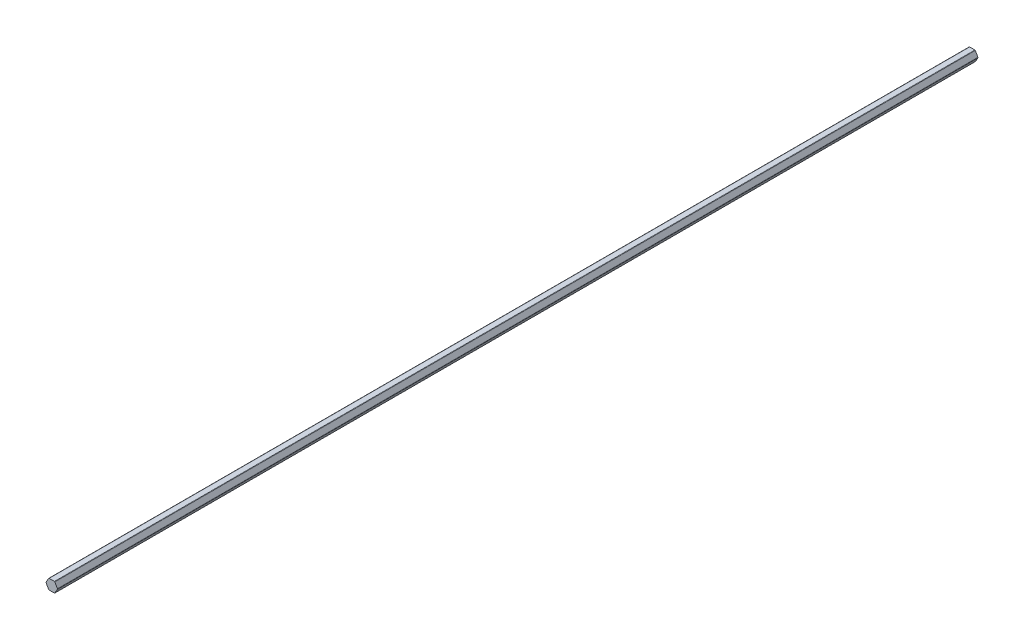
ISO-10303-21;
HEADER;
FILE_DESCRIPTION(('STEP AP214'),'2;1');
FILE_NAME('part.step','',(''),(''),'','','');
FILE_SCHEMA(('AUTOMOTIVE_DESIGN { 1 0 10303 214 1 1 1 1 }'));
ENDSEC;
DATA;
#1=APPLICATION_CONTEXT('core data for automotive mechanical design processes');
#2=APPLICATION_PROTOCOL_DEFINITION('international standard','automotive_design',2000,#1);
#3=PRODUCT_CONTEXT('',#1,'mechanical');
#4=PRODUCT('Part','Part','',(#3));
#5=PRODUCT_RELATED_PRODUCT_CATEGORY('part','',(#4));
#6=PRODUCT_DEFINITION_FORMATION('','',#4);
#7=PRODUCT_DEFINITION_CONTEXT('part definition',#1,'design');
#8=PRODUCT_DEFINITION('design','',#6,#7);
#9=PRODUCT_DEFINITION_SHAPE('','',#8);
#10=(LENGTH_UNIT() NAMED_UNIT(*) SI_UNIT(.MILLI.,.METRE.));
#11=(NAMED_UNIT(*) PLANE_ANGLE_UNIT() SI_UNIT($,.RADIAN.));
#12=(NAMED_UNIT(*) SI_UNIT($,.STERADIAN.) SOLID_ANGLE_UNIT());
#13=UNCERTAINTY_MEASURE_WITH_UNIT(LENGTH_MEASURE(1.E-05),#10,'distance_accuracy_value','');
#14=(GEOMETRIC_REPRESENTATION_CONTEXT(3) GLOBAL_UNCERTAINTY_ASSIGNED_CONTEXT((#13)) GLOBAL_UNIT_ASSIGNED_CONTEXT((#10,
#11,#12)) REPRESENTATION_CONTEXT('',''));
#15=CARTESIAN_POINT('',(0.,0.,0.));
#16=DIRECTION('',(0.,0.,1.));
#17=DIRECTION('',(1.,0.,0.));
#18=AXIS2_PLACEMENT_3D('',#15,#16,#17);
#19=CARTESIAN_POINT('',(2.44900437184856,4.2418,457.2));
#20=DIRECTION('',(0.,0.,-1.));
#21=DIRECTION('',(-1.,0.,0.));
#22=AXIS2_PLACEMENT_3D('',#19,#20,#21);
#23=CYLINDRICAL_SURFACE('',#22,0.508);
#24=CARTESIAN_POINT('',(2.44900437184856,4.2418,-431.8));
#25=DIRECTION('',(0.,0.,-1.));
#26=DIRECTION('',(-1.,0.,0.));
#27=AXIS2_PLACEMENT_3D('',#24,#25,#26);
#28=CIRCLE('',#27,0.508);
#29=CARTESIAN_POINT('',(2.88894527697105,4.4958,-431.8));
#30=VERTEX_POINT('',#29);
#31=CARTESIAN_POINT('',(2.44900437184856,4.7498,-431.8));
#32=VERTEX_POINT('',#31);
#33=EDGE_CURVE('E267',#30,#32,#28,.F.);
#34=ORIENTED_EDGE('',*,*,#33,.T.);
#35=DIRECTION('',(0.,0.,-1.));
#36=VECTOR('',#35,1.);
#37=CARTESIAN_POINT('',(2.44900437184856,4.7498,457.2));
#38=LINE('',#37,#36);
#39=CARTESIAN_POINT('',(2.44900437184856,4.7498,431.8));
#40=VERTEX_POINT('',#39);
#41=EDGE_CURVE('E211',#40,#32,#38,.T.);
#42=ORIENTED_EDGE('',*,*,#41,.F.);
#43=CARTESIAN_POINT('',(2.44900437184856,4.2418,431.8));
#44=DIRECTION('',(0.,0.,1.));
#45=DIRECTION('',(1.,0.,0.));
#46=AXIS2_PLACEMENT_3D('',#43,#44,#45);
#47=CIRCLE('',#46,0.508);
#48=CARTESIAN_POINT('',(2.88894527697105,4.4958,431.8));
#49=VERTEX_POINT('',#48);
#50=EDGE_CURVE('E235',#40,#49,#47,.F.);
#51=ORIENTED_EDGE('',*,*,#50,.T.);
#52=DIRECTION('',(0.,0.,1.));
#53=VECTOR('',#52,1.);
#54=CARTESIAN_POINT('',(2.88894527697105,4.4958,457.2));
#55=LINE('',#54,#53);
#56=EDGE_CURVE('E202',#30,#49,#55,.T.);
#57=ORIENTED_EDGE('',*,*,#56,.F.);
#58=EDGE_LOOP('',(#34,#42,#51,#57));
#59=FACE_BOUND('',#58,.T.);
#60=ADVANCED_FACE('F51',(#59),#23,.T.);
#61=CARTESIAN_POINT('',(4.89800874369711,0.,457.2));
#62=DIRECTION('',(0.,0.,-1.));
#63=DIRECTION('',(-1.,0.,0.));
#64=AXIS2_PLACEMENT_3D('',#61,#62,#63);
#65=CYLINDRICAL_SURFACE('',#64,0.508);
#66=CARTESIAN_POINT('',(4.89800874369711,0.,-431.8));
#67=DIRECTION('',(0.,0.,-1.));
#68=DIRECTION('',(-1.,0.,0.));
#69=AXIS2_PLACEMENT_3D('',#66,#67,#68);
#70=CIRCLE('',#69,0.508);
#71=CARTESIAN_POINT('',(5.3379496488196,-0.254,-431.8));
#72=VERTEX_POINT('',#71);
#73=CARTESIAN_POINT('',(5.33794964881961,0.254000000000003,-431.8));
#74=VERTEX_POINT('',#73);
#75=EDGE_CURVE('E278',#72,#74,#70,.F.);
#76=ORIENTED_EDGE('',*,*,#75,.T.);
#77=DIRECTION('',(0.,0.,-1.));
#78=VECTOR('',#77,1.);
#79=CARTESIAN_POINT('',(5.3379496488196,0.254,457.2));
#80=LINE('',#79,#78);
#81=CARTESIAN_POINT('',(5.33794964881961,0.254,431.8));
#82=VERTEX_POINT('',#81);
#83=EDGE_CURVE('E171',#82,#74,#80,.T.);
#84=ORIENTED_EDGE('',*,*,#83,.F.);
#85=CARTESIAN_POINT('',(4.89800874369711,0.,431.8));
#86=DIRECTION('',(0.,0.,1.));
#87=DIRECTION('',(1.,0.,0.));
#88=AXIS2_PLACEMENT_3D('',#85,#86,#87);
#89=CIRCLE('',#88,0.508);
#90=CARTESIAN_POINT('',(5.3379496488196,-0.254000000000002,431.8));
#91=VERTEX_POINT('',#90);
#92=EDGE_CURVE('E174',#82,#91,#89,.F.);
#93=ORIENTED_EDGE('',*,*,#92,.T.);
#94=DIRECTION('',(0.,0.,1.));
#95=VECTOR('',#94,1.);
#96=CARTESIAN_POINT('',(5.3379496488196,-0.254,457.2));
#97=LINE('',#96,#95);
#98=EDGE_CURVE('E187',#72,#91,#97,.T.);
#99=ORIENTED_EDGE('',*,*,#98,.F.);
#100=EDGE_LOOP('',(#76,#84,#93,#99));
#101=FACE_BOUND('',#100,.T.);
#102=ADVANCED_FACE('F325',(#101),#65,.T.);
#103=CARTESIAN_POINT('',(2.44900437184856,-4.2418,457.2));
#104=DIRECTION('',(0.,0.,-1.));
#105=DIRECTION('',(-1.,0.,0.));
#106=AXIS2_PLACEMENT_3D('',#103,#104,#105);
#107=CYLINDRICAL_SURFACE('',#106,0.508);
#108=CARTESIAN_POINT('',(2.44900437184856,-4.2418,-431.8));
#109=DIRECTION('',(0.,0.,-1.));
#110=DIRECTION('',(-1.,0.,0.));
#111=AXIS2_PLACEMENT_3D('',#108,#109,#110);
#112=CIRCLE('',#111,0.508);
#113=CARTESIAN_POINT('',(2.44900437184855,-4.7498,-431.8));
#114=VERTEX_POINT('',#113);
#115=CARTESIAN_POINT('',(2.88894527697105,-4.4958,-431.8));
#116=VERTEX_POINT('',#115);
#117=EDGE_CURVE('E286',#114,#116,#112,.F.);
#118=ORIENTED_EDGE('',*,*,#117,.T.);
#119=DIRECTION('',(0.,0.,-1.));
#120=VECTOR('',#119,1.);
#121=CARTESIAN_POINT('',(2.88894527697105,-4.4958,457.2));
#122=LINE('',#121,#120);
#123=CARTESIAN_POINT('',(2.88894527697105,-4.4958,431.8));
#124=VERTEX_POINT('',#123);
#125=EDGE_CURVE('E189',#124,#116,#122,.T.);
#126=ORIENTED_EDGE('',*,*,#125,.F.);
#127=CARTESIAN_POINT('',(2.44900437184856,-4.2418,431.8));
#128=DIRECTION('',(0.,0.,1.));
#129=DIRECTION('',(1.,0.,0.));
#130=AXIS2_PLACEMENT_3D('',#127,#128,#129);
#131=CIRCLE('',#130,0.508);
#132=CARTESIAN_POINT('',(2.44900437184855,-4.7498,431.8));
#133=VERTEX_POINT('',#132);
#134=EDGE_CURVE('E230',#124,#133,#131,.F.);
#135=ORIENTED_EDGE('',*,*,#134,.T.);
#136=DIRECTION('',(0.,0.,1.));
#137=VECTOR('',#136,1.);
#138=CARTESIAN_POINT('',(2.44900437184856,-4.7498,457.2));
#139=LINE('',#138,#137);
#140=EDGE_CURVE('E182',#114,#133,#139,.T.);
#141=ORIENTED_EDGE('',*,*,#140,.F.);
#142=EDGE_LOOP('',(#118,#126,#135,#141));
#143=FACE_BOUND('',#142,.T.);
#144=ADVANCED_FACE('F332',(#143),#107,.T.);
#145=CARTESIAN_POINT('',(-4.89800874369711,0.,457.2));
#146=DIRECTION('',(0.,0.,-1.));
#147=DIRECTION('',(-1.,0.,0.));
#148=AXIS2_PLACEMENT_3D('',#145,#146,#147);
#149=CYLINDRICAL_SURFACE('',#148,0.508);
#150=DIRECTION('',(0.,0.,1.));
#151=VECTOR('',#150,1.);
#152=CARTESIAN_POINT('',(-5.3379496488196,0.253999999999997,457.2));
#153=LINE('',#152,#151);
#154=CARTESIAN_POINT('',(-5.3379496488196,0.254,-431.8));
#155=VERTEX_POINT('',#154);
#156=CARTESIAN_POINT('',(-5.3379496488196,0.254000000000002,431.8));
#157=VERTEX_POINT('',#156);
#158=EDGE_CURVE('E158',#155,#157,#153,.T.);
#159=ORIENTED_EDGE('',*,*,#158,.F.);
#160=CARTESIAN_POINT('',(-4.89800874369711,0.,-431.8));
#161=DIRECTION('',(0.,0.,-1.));
#162=DIRECTION('',(-1.,0.,0.));
#163=AXIS2_PLACEMENT_3D('',#160,#161,#162);
#164=CIRCLE('',#163,0.508);
#165=CARTESIAN_POINT('',(-5.40600874369711,0.,-431.8));
#166=VERTEX_POINT('',#165);
#167=EDGE_CURVE('E147',#155,#166,#164,.F.);
#168=ORIENTED_EDGE('',*,*,#167,.T.);
#169=DIRECTION('',(0.,0.,-1.));
#170=VECTOR('',#169,1.);
#171=CARTESIAN_POINT('',(-5.40600874369711,0.,457.2));
#172=LINE('',#171,#170);
#173=CARTESIAN_POINT('',(-5.40600874369711,0.,431.8));
#174=VERTEX_POINT('',#173);
#175=EDGE_CURVE('E157',#174,#166,#172,.T.);
#176=ORIENTED_EDGE('',*,*,#175,.F.);
#177=CARTESIAN_POINT('',(-4.89800874369711,0.,431.8));
#178=DIRECTION('',(0.,0.,1.));
#179=DIRECTION('',(1.,0.,0.));
#180=AXIS2_PLACEMENT_3D('',#177,#178,#179);
#181=CIRCLE('',#180,0.508);
#182=EDGE_CURVE('E74',#174,#157,#181,.F.);
#183=ORIENTED_EDGE('',*,*,#182,.T.);
#184=EDGE_LOOP('',(#159,#168,#176,#183));
#185=FACE_BOUND('',#184,.T.);
#186=ADVANCED_FACE('F156',(#185),#149,.T.);
#187=CARTESIAN_POINT('',(-2.44900437184856,4.2418,457.2));
#188=DIRECTION('',(0.,0.,-1.));
#189=DIRECTION('',(-1.,0.,0.));
#190=AXIS2_PLACEMENT_3D('',#187,#188,#189);
#191=CYLINDRICAL_SURFACE('',#190,0.508);
#192=CARTESIAN_POINT('',(-2.44900437184856,4.2418,-431.8));
#193=DIRECTION('',(0.,0.,-1.));
#194=DIRECTION('',(-1.,0.,0.));
#195=AXIS2_PLACEMENT_3D('',#192,#193,#194);
#196=CIRCLE('',#195,0.508);
#197=CARTESIAN_POINT('',(-2.44900437184856,4.7498,-431.8));
#198=VERTEX_POINT('',#197);
#199=CARTESIAN_POINT('',(-2.88894527697105,4.4958,-431.8));
#200=VERTEX_POINT('',#199);
#201=EDGE_CURVE('E281',#198,#200,#196,.F.);
#202=ORIENTED_EDGE('',*,*,#201,.T.);
#203=DIRECTION('',(0.,0.,-1.));
#204=VECTOR('',#203,1.);
#205=CARTESIAN_POINT('',(-2.88894527697105,4.4958,457.2));
#206=LINE('',#205,#204);
#207=CARTESIAN_POINT('',(-2.88894527697105,4.4958,431.8));
#208=VERTEX_POINT('',#207);
#209=EDGE_CURVE('E185',#208,#200,#206,.T.);
#210=ORIENTED_EDGE('',*,*,#209,.F.);
#211=CARTESIAN_POINT('',(-2.44900437184856,4.2418,431.8));
#212=DIRECTION('',(0.,0.,1.));
#213=DIRECTION('',(1.,0.,0.));
#214=AXIS2_PLACEMENT_3D('',#211,#212,#213);
#215=CIRCLE('',#214,0.508);
#216=CARTESIAN_POINT('',(-2.44900437184856,4.7498,431.8));
#217=VERTEX_POINT('',#216);
#218=EDGE_CURVE('E250',#208,#217,#215,.F.);
#219=ORIENTED_EDGE('',*,*,#218,.T.);
#220=DIRECTION('',(0.,0.,1.));
#221=VECTOR('',#220,1.);
#222=CARTESIAN_POINT('',(-2.44900437184856,4.7498,457.2));
#223=LINE('',#222,#221);
#224=EDGE_CURVE('E205',#198,#217,#223,.T.);
#225=ORIENTED_EDGE('',*,*,#224,.F.);
#226=EDGE_LOOP('',(#202,#210,#219,#225));
#227=FACE_BOUND('',#226,.T.);
#228=ADVANCED_FACE('F344',(#227),#191,.T.);
#229=CARTESIAN_POINT('',(-2.44900437184855,-4.2418,457.2));
#230=DIRECTION('',(0.,0.,-1.));
#231=DIRECTION('',(-1.,0.,0.));
#232=AXIS2_PLACEMENT_3D('',#229,#230,#231);
#233=CYLINDRICAL_SURFACE('',#232,0.508);
#234=CARTESIAN_POINT('',(-2.44900437184855,-4.2418,-431.8));
#235=DIRECTION('',(0.,0.,-1.));
#236=DIRECTION('',(-1.,0.,0.));
#237=AXIS2_PLACEMENT_3D('',#234,#235,#236);
#238=CIRCLE('',#237,0.508);
#239=CARTESIAN_POINT('',(-2.88894527697105,-4.4958,-431.8));
#240=VERTEX_POINT('',#239);
#241=CARTESIAN_POINT('',(-2.44900437184855,-4.7498,-431.8));
#242=VERTEX_POINT('',#241);
#243=EDGE_CURVE('E161',#240,#242,#238,.F.);
#244=ORIENTED_EDGE('',*,*,#243,.T.);
#245=DIRECTION('',(0.,0.,-1.));
#246=VECTOR('',#245,1.);
#247=CARTESIAN_POINT('',(-2.44900437184855,-4.7498,457.2));
#248=LINE('',#247,#246);
#249=CARTESIAN_POINT('',(-2.44900437184855,-4.7498,431.8));
#250=VERTEX_POINT('',#249);
#251=EDGE_CURVE('E178',#250,#242,#248,.T.);
#252=ORIENTED_EDGE('',*,*,#251,.F.);
#253=CARTESIAN_POINT('',(-2.44900437184855,-4.2418,431.8));
#254=DIRECTION('',(0.,0.,1.));
#255=DIRECTION('',(1.,0.,0.));
#256=AXIS2_PLACEMENT_3D('',#253,#254,#255);
#257=CIRCLE('',#256,0.508);
#258=CARTESIAN_POINT('',(-2.88894527697105,-4.4958,431.8));
#259=VERTEX_POINT('',#258);
#260=EDGE_CURVE('E254',#250,#259,#257,.F.);
#261=ORIENTED_EDGE('',*,*,#260,.T.);
#262=DIRECTION('',(0.,0.,1.));
#263=VECTOR('',#262,1.);
#264=CARTESIAN_POINT('',(-2.88894527697104,-4.4958,457.2));
#265=LINE('',#264,#263);
#266=EDGE_CURVE('E183',#240,#259,#265,.T.);
#267=ORIENTED_EDGE('',*,*,#266,.F.);
#268=EDGE_LOOP('',(#244,#252,#261,#267));
#269=FACE_BOUND('',#268,.T.);
#270=ADVANCED_FACE('F303',(#269),#233,.T.);
#271=CARTESIAN_POINT('',(2.74229830859688,-4.7498,457.2));
#272=DIRECTION('',(-0.866025403784439,0.5,0.));
#273=DIRECTION('',(0.,0.,1.));
#274=AXIS2_PLACEMENT_3D('',#271,#272,#273);
#275=PLANE('',#274);
#276=DIRECTION('',(-0.5,-0.866025403784439,0.));
#277=VECTOR('',#276,1.);
#278=CARTESIAN_POINT('',(2.74229830859688,-4.7498,-431.8));
#279=LINE('',#278,#277);
#280=EDGE_CURVE('E282',#72,#116,#279,.T.);
#281=ORIENTED_EDGE('',*,*,#280,.F.);
#282=ORIENTED_EDGE('',*,*,#98,.T.);
#283=DIRECTION('',(0.5,0.866025403784439,0.));
#284=VECTOR('',#283,1.);
#285=CARTESIAN_POINT('',(2.74229830859688,-4.7498,431.8));
#286=LINE('',#285,#284);
#287=EDGE_CURVE('E166',#124,#91,#286,.T.);
#288=ORIENTED_EDGE('',*,*,#287,.F.);
#289=ORIENTED_EDGE('',*,*,#125,.T.);
#290=EDGE_LOOP('',(#281,#282,#288,#289));
#291=FACE_BOUND('',#290,.T.);
#292=ADVANCED_FACE('F320',(#291),#275,.F.);
#293=CARTESIAN_POINT('',(-2.74229830859688,-4.7498,457.2));
#294=DIRECTION('',(0.,1.,0.));
#295=DIRECTION('',(1.,0.,0.));
#296=AXIS2_PLACEMENT_3D('',#293,#294,#295);
#297=PLANE('',#296);
#298=DIRECTION('',(-1.,0.,0.));
#299=VECTOR('',#298,1.);
#300=CARTESIAN_POINT('',(-2.74229830859688,-4.7498,-431.8));
#301=LINE('',#300,#299);
#302=EDGE_CURVE('E289',#114,#242,#301,.T.);
#303=ORIENTED_EDGE('',*,*,#302,.F.);
#304=ORIENTED_EDGE('',*,*,#140,.T.);
#305=DIRECTION('',(1.,0.,0.));
#306=VECTOR('',#305,1.);
#307=CARTESIAN_POINT('',(-2.74229830859688,-4.7498,431.8));
#308=LINE('',#307,#306);
#309=EDGE_CURVE('E239',#250,#133,#308,.T.);
#310=ORIENTED_EDGE('',*,*,#309,.F.);
#311=ORIENTED_EDGE('',*,*,#251,.T.);
#312=EDGE_LOOP('',(#303,#304,#310,#311));
#313=FACE_BOUND('',#312,.T.);
#314=ADVANCED_FACE('F308',(#313),#297,.F.);
#315=CARTESIAN_POINT('',(-5.48459661719377,0.,457.2));
#316=DIRECTION('',(0.866025403784438,0.5,0.));
#317=DIRECTION('',(0.,0.,-1.));
#318=AXIS2_PLACEMENT_3D('',#315,#316,#317);
#319=PLANE('',#318);
#320=DIRECTION('',(-0.5,0.866025403784438,0.));
#321=VECTOR('',#320,1.);
#322=CARTESIAN_POINT('',(-5.48459661719377,0.,-431.8));
#323=LINE('',#322,#321);
#324=CARTESIAN_POINT('',(-5.3379496488196,-0.254,-431.8));
#325=VERTEX_POINT('',#324);
#326=EDGE_CURVE('E67',#240,#325,#323,.T.);
#327=ORIENTED_EDGE('',*,*,#326,.F.);
#328=ORIENTED_EDGE('',*,*,#266,.T.);
#329=DIRECTION('',(0.5,-0.866025403784438,0.));
#330=VECTOR('',#329,1.);
#331=CARTESIAN_POINT('',(-5.48459661719377,0.,431.8));
#332=LINE('',#331,#330);
#333=CARTESIAN_POINT('',(-5.33794964881961,-0.254000000000003,431.8));
#334=VERTEX_POINT('',#333);
#335=EDGE_CURVE('E260',#334,#259,#332,.T.);
#336=ORIENTED_EDGE('',*,*,#335,.F.);
#337=DIRECTION('',(0.,0.,-1.));
#338=VECTOR('',#337,1.);
#339=CARTESIAN_POINT('',(-5.3379496488196,-0.254,457.2));
#340=LINE('',#339,#338);
#341=EDGE_CURVE('E165',#334,#325,#340,.T.);
#342=ORIENTED_EDGE('',*,*,#341,.T.);
#343=EDGE_LOOP('',(#327,#328,#336,#342));
#344=FACE_BOUND('',#343,.T.);
#345=ADVANCED_FACE('F312',(#344),#319,.F.);
#346=CARTESIAN_POINT('',(-2.74229830859688,4.7498,457.2));
#347=DIRECTION('',(0.866025403784439,-0.5,0.));
#348=DIRECTION('',(0.,0.,-1.));
#349=AXIS2_PLACEMENT_3D('',#346,#347,#348);
#350=PLANE('',#349);
#351=DIRECTION('',(0.5,0.866025403784439,0.));
#352=VECTOR('',#351,1.);
#353=CARTESIAN_POINT('',(-2.74229830859688,4.7498,-431.8));
#354=LINE('',#353,#352);
#355=EDGE_CURVE('E160',#155,#200,#354,.T.);
#356=ORIENTED_EDGE('',*,*,#355,.F.);
#357=ORIENTED_EDGE('',*,*,#158,.T.);
#358=DIRECTION('',(-0.5,-0.866025403784439,0.));
#359=VECTOR('',#358,1.);
#360=CARTESIAN_POINT('',(-2.74229830859688,4.7498,431.8));
#361=LINE('',#360,#359);
#362=EDGE_CURVE('E255',#208,#157,#361,.T.);
#363=ORIENTED_EDGE('',*,*,#362,.F.);
#364=ORIENTED_EDGE('',*,*,#209,.T.);
#365=EDGE_LOOP('',(#356,#357,#363,#364));
#366=FACE_BOUND('',#365,.T.);
#367=ADVANCED_FACE('F53',(#366),#350,.F.);
#368=CARTESIAN_POINT('',(2.74229830859688,4.7498,457.2));
#369=DIRECTION('',(0.,-1.,0.));
#370=DIRECTION('',(0.,0.,-1.));
#371=AXIS2_PLACEMENT_3D('',#368,#369,#370);
#372=PLANE('',#371);
#373=DIRECTION('',(1.,0.,0.));
#374=VECTOR('',#373,1.);
#375=CARTESIAN_POINT('',(2.74229830859688,4.7498,-431.8));
#376=LINE('',#375,#374);
#377=EDGE_CURVE('E270',#198,#32,#376,.T.);
#378=ORIENTED_EDGE('',*,*,#377,.F.);
#379=ORIENTED_EDGE('',*,*,#224,.T.);
#380=DIRECTION('',(-1.,0.,0.));
#381=VECTOR('',#380,1.);
#382=CARTESIAN_POINT('',(2.74229830859688,4.7498,431.8));
#383=LINE('',#382,#381);
#384=EDGE_CURVE('E246',#40,#217,#383,.T.);
#385=ORIENTED_EDGE('',*,*,#384,.F.);
#386=ORIENTED_EDGE('',*,*,#41,.T.);
#387=EDGE_LOOP('',(#378,#379,#385,#386));
#388=FACE_BOUND('',#387,.T.);
#389=ADVANCED_FACE('F319',(#388),#372,.F.);
#390=CARTESIAN_POINT('',(5.48459661719377,0.,457.2));
#391=DIRECTION('',(-0.866025403784439,-0.5,0.));
#392=DIRECTION('',(-0.5,0.866025403784439,0.));
#393=AXIS2_PLACEMENT_3D('',#390,#391,#392);
#394=PLANE('',#393);
#395=DIRECTION('',(0.5,-0.866025403784439,0.));
#396=VECTOR('',#395,1.);
#397=CARTESIAN_POINT('',(5.48459661719377,0.,-431.8));
#398=LINE('',#397,#396);
#399=EDGE_CURVE('E274',#30,#74,#398,.T.);
#400=ORIENTED_EDGE('',*,*,#399,.F.);
#401=ORIENTED_EDGE('',*,*,#56,.T.);
#402=DIRECTION('',(-0.5,0.866025403784439,0.));
#403=VECTOR('',#402,1.);
#404=CARTESIAN_POINT('',(5.48459661719377,0.,431.8));
#405=LINE('',#404,#403);
#406=EDGE_CURVE('E231',#82,#49,#405,.T.);
#407=ORIENTED_EDGE('',*,*,#406,.F.);
#408=ORIENTED_EDGE('',*,*,#83,.T.);
#409=EDGE_LOOP('',(#400,#401,#407,#408));
#410=FACE_BOUND('',#409,.T.);
#411=ADVANCED_FACE('F338',(#410),#394,.F.);
#412=CARTESIAN_POINT('',(-4.89800874369711,0.,457.2));
#413=DIRECTION('',(0.,0.,-1.));
#414=DIRECTION('',(-1.,0.,0.));
#415=AXIS2_PLACEMENT_3D('',#412,#413,#414);
#416=CYLINDRICAL_SURFACE('',#415,0.508);
#417=ORIENTED_EDGE('',*,*,#175,.T.);
#418=CARTESIAN_POINT('',(-4.89800874369711,0.,-431.8));
#419=DIRECTION('',(0.,0.,-1.));
#420=DIRECTION('',(-1.,0.,0.));
#421=AXIS2_PLACEMENT_3D('',#418,#419,#420);
#422=CIRCLE('',#421,0.508);
#423=EDGE_CURVE('E11',#166,#325,#422,.F.);
#424=ORIENTED_EDGE('',*,*,#423,.T.);
#425=ORIENTED_EDGE('',*,*,#341,.F.);
#426=CARTESIAN_POINT('',(-4.89800874369711,0.,431.8));
#427=DIRECTION('',(0.,0.,1.));
#428=DIRECTION('',(1.,0.,0.));
#429=AXIS2_PLACEMENT_3D('',#426,#427,#428);
#430=CIRCLE('',#429,0.508);
#431=EDGE_CURVE('E60',#334,#174,#430,.F.);
#432=ORIENTED_EDGE('',*,*,#431,.T.);
#433=EDGE_LOOP('',(#417,#424,#425,#432));
#434=FACE_BOUND('',#433,.T.);
#435=ADVANCED_FACE('F163',(#434),#416,.T.);
#436=CARTESIAN_POINT('',(0.,0.,431.8));
#437=DIRECTION('',(0.,0.,1.));
#438=DIRECTION('',(1.,0.,0.));
#439=AXIS2_PLACEMENT_3D('',#436,#437,#438);
#440=PLANE('',#439);
#441=ORIENTED_EDGE('',*,*,#287,.T.);
#442=ORIENTED_EDGE('',*,*,#92,.F.);
#443=ORIENTED_EDGE('',*,*,#406,.T.);
#444=ORIENTED_EDGE('',*,*,#50,.F.);
#445=ORIENTED_EDGE('',*,*,#384,.T.);
#446=ORIENTED_EDGE('',*,*,#218,.F.);
#447=ORIENTED_EDGE('',*,*,#362,.T.);
#448=ORIENTED_EDGE('',*,*,#182,.F.);
#449=ORIENTED_EDGE('',*,*,#431,.F.);
#450=ORIENTED_EDGE('',*,*,#335,.T.);
#451=ORIENTED_EDGE('',*,*,#260,.F.);
#452=ORIENTED_EDGE('',*,*,#309,.T.);
#453=ORIENTED_EDGE('',*,*,#134,.F.);
#454=EDGE_LOOP('',(#441,#442,#443,#444,#445,#446,#447,#448,#449,#450,#451,#452,#453));
#455=FACE_BOUND('',#454,.T.);
#456=ADVANCED_FACE('F309',(#455),#440,.T.);
#457=CARTESIAN_POINT('',(0.,0.,-431.8));
#458=DIRECTION('',(0.,0.,-1.));
#459=DIRECTION('',(-1.,0.,0.));
#460=AXIS2_PLACEMENT_3D('',#457,#458,#459);
#461=PLANE('',#460);
#462=ORIENTED_EDGE('',*,*,#33,.F.);
#463=ORIENTED_EDGE('',*,*,#399,.T.);
#464=ORIENTED_EDGE('',*,*,#75,.F.);
#465=ORIENTED_EDGE('',*,*,#280,.T.);
#466=ORIENTED_EDGE('',*,*,#117,.F.);
#467=ORIENTED_EDGE('',*,*,#302,.T.);
#468=ORIENTED_EDGE('',*,*,#243,.F.);
#469=ORIENTED_EDGE('',*,*,#326,.T.);
#470=ORIENTED_EDGE('',*,*,#423,.F.);
#471=ORIENTED_EDGE('',*,*,#167,.F.);
#472=ORIENTED_EDGE('',*,*,#355,.T.);
#473=ORIENTED_EDGE('',*,*,#201,.F.);
#474=ORIENTED_EDGE('',*,*,#377,.T.);
#475=EDGE_LOOP('',(#462,#463,#464,#465,#466,#467,#468,#469,#470,#471,#472,#473,#474));
#476=FACE_BOUND('',#475,.T.);
#477=ADVANCED_FACE('F145',(#476),#461,.T.);
#478=CLOSED_SHELL('',(#60,#102,#144,#186,#228,#270,#292,#314,#345,#367,#389,#411,#435,#456,#477));
#479=MANIFOLD_SOLID_BREP('B2',#478);
#480=ADVANCED_BREP_SHAPE_REPRESENTATION('',(#18,#479),#14);
#481=SHAPE_DEFINITION_REPRESENTATION(#9,#480);
ENDSEC;
END-ISO-10303-21;
